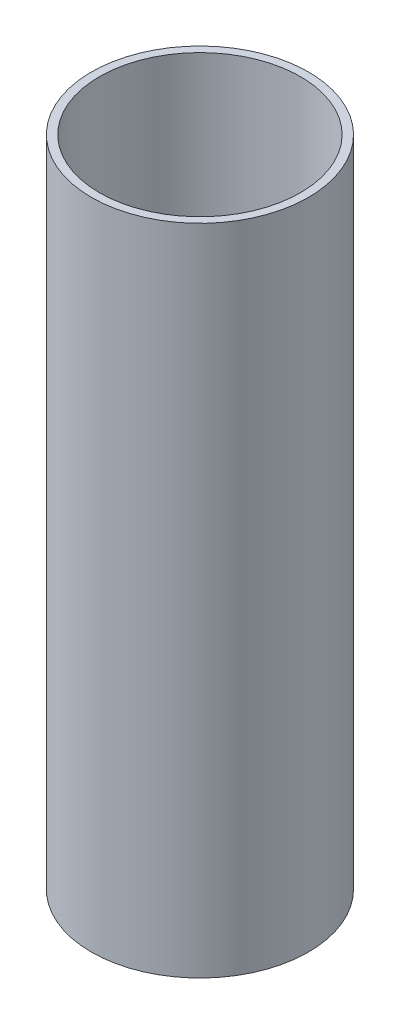
ISO-10303-21;
HEADER;
FILE_DESCRIPTION(('STEP AP214'),'2;1');
FILE_NAME('part.step','',(''),(''),'','','');
FILE_SCHEMA(('AUTOMOTIVE_DESIGN { 1 0 10303 214 1 1 1 1 }'));
ENDSEC;
DATA;
#1=APPLICATION_CONTEXT('core data for automotive mechanical design processes');
#2=APPLICATION_PROTOCOL_DEFINITION('international standard','automotive_design',2000,#1);
#3=PRODUCT_CONTEXT('',#1,'mechanical');
#4=PRODUCT('Part','Part','',(#3));
#5=PRODUCT_RELATED_PRODUCT_CATEGORY('part','',(#4));
#6=PRODUCT_DEFINITION_FORMATION('','',#4);
#7=PRODUCT_DEFINITION_CONTEXT('part definition',#1,'design');
#8=PRODUCT_DEFINITION('design','',#6,#7);
#9=PRODUCT_DEFINITION_SHAPE('','',#8);
#10=(LENGTH_UNIT() NAMED_UNIT(*) SI_UNIT(.MILLI.,.METRE.));
#11=(NAMED_UNIT(*) PLANE_ANGLE_UNIT() SI_UNIT($,.RADIAN.));
#12=(NAMED_UNIT(*) SI_UNIT($,.STERADIAN.) SOLID_ANGLE_UNIT());
#13=UNCERTAINTY_MEASURE_WITH_UNIT(LENGTH_MEASURE(1.E-05),#10,'distance_accuracy_value','');
#14=(GEOMETRIC_REPRESENTATION_CONTEXT(3) GLOBAL_UNCERTAINTY_ASSIGNED_CONTEXT((#13)) GLOBAL_UNIT_ASSIGNED_CONTEXT((#10,
#11,#12)) REPRESENTATION_CONTEXT('',''));
#15=CARTESIAN_POINT('',(0.,0.,0.));
#16=DIRECTION('',(0.,0.,1.));
#17=DIRECTION('',(1.,0.,0.));
#18=AXIS2_PLACEMENT_3D('',#15,#16,#17);
#19=CARTESIAN_POINT('',(0.,82.55,0.));
#20=DIRECTION('',(0.,1.,0.));
#21=DIRECTION('',(0.,0.,1.));
#22=AXIS2_PLACEMENT_3D('',#19,#20,#21);
#23=PLANE('',#22);
#24=CARTESIAN_POINT('',(0.,82.55,0.));
#25=DIRECTION('',(0.,1.,0.));
#26=DIRECTION('',(0.,0.,1.));
#27=AXIS2_PLACEMENT_3D('',#24,#25,#26);
#28=CIRCLE('',#27,13.716);
#29=CARTESIAN_POINT('',(0.,82.55,13.716));
#30=VERTEX_POINT('',#29);
#31=EDGE_CURVE('E10',#30,#30,#28,.T.);
#32=ORIENTED_EDGE('',*,*,#31,.T.);
#33=EDGE_LOOP('',(#32));
#34=FACE_BOUND('',#33,.T.);
#35=CARTESIAN_POINT('',(0.,82.55,0.));
#36=DIRECTION('',(0.,1.,0.));
#37=DIRECTION('',(0.,0.,1.));
#38=AXIS2_PLACEMENT_3D('',#35,#36,#37);
#39=CIRCLE('',#38,12.7);
#40=CARTESIAN_POINT('',(0.,82.55,12.7));
#41=VERTEX_POINT('',#40);
#42=EDGE_CURVE('E41',#41,#41,#39,.T.);
#43=ORIENTED_EDGE('',*,*,#42,.F.);
#44=EDGE_LOOP('',(#43));
#45=FACE_BOUND('',#44,.T.);
#46=ADVANCED_FACE('F30',(#34,#45),#23,.T.);
#47=CARTESIAN_POINT('',(0.,0.,0.));
#48=DIRECTION('',(0.,1.,0.));
#49=DIRECTION('',(0.,0.,1.));
#50=AXIS2_PLACEMENT_3D('',#47,#48,#49);
#51=PLANE('',#50);
#52=CARTESIAN_POINT('',(0.,0.,0.));
#53=DIRECTION('',(0.,1.,0.));
#54=DIRECTION('',(0.,0.,1.));
#55=AXIS2_PLACEMENT_3D('',#52,#53,#54);
#56=CIRCLE('',#55,13.716);
#57=CARTESIAN_POINT('',(0.,0.,13.716));
#58=VERTEX_POINT('',#57);
#59=EDGE_CURVE('E34',#58,#58,#56,.T.);
#60=ORIENTED_EDGE('',*,*,#59,.F.);
#61=EDGE_LOOP('',(#60));
#62=FACE_BOUND('',#61,.T.);
#63=CARTESIAN_POINT('',(0.,0.,0.));
#64=DIRECTION('',(0.,1.,0.));
#65=DIRECTION('',(0.,0.,1.));
#66=AXIS2_PLACEMENT_3D('',#63,#64,#65);
#67=CIRCLE('',#66,12.7);
#68=CARTESIAN_POINT('',(0.,0.,12.7));
#69=VERTEX_POINT('',#68);
#70=EDGE_CURVE('E43',#69,#69,#67,.T.);
#71=ORIENTED_EDGE('',*,*,#70,.T.);
#72=EDGE_LOOP('',(#71));
#73=FACE_BOUND('',#72,.T.);
#74=ADVANCED_FACE('F53',(#62,#73),#51,.F.);
#75=CARTESIAN_POINT('',(0.,82.55,0.));
#76=DIRECTION('',(0.,-1.,0.));
#77=DIRECTION('',(0.,0.,-1.));
#78=AXIS2_PLACEMENT_3D('',#75,#76,#77);
#79=CYLINDRICAL_SURFACE('',#78,13.716);
#80=ORIENTED_EDGE('',*,*,#31,.F.);
#81=EDGE_LOOP('',(#80));
#82=FACE_BOUND('',#81,.T.);
#83=ORIENTED_EDGE('',*,*,#59,.T.);
#84=EDGE_LOOP('',(#83));
#85=FACE_BOUND('',#84,.T.);
#86=ADVANCED_FACE('F32',(#82,#85),#79,.T.);
#87=CARTESIAN_POINT('',(0.,82.55,0.));
#88=DIRECTION('',(0.,-1.,0.));
#89=DIRECTION('',(0.,0.,-1.));
#90=AXIS2_PLACEMENT_3D('',#87,#88,#89);
#91=CYLINDRICAL_SURFACE('',#90,12.7);
#92=ORIENTED_EDGE('',*,*,#42,.T.);
#93=EDGE_LOOP('',(#92));
#94=FACE_BOUND('',#93,.T.);
#95=ORIENTED_EDGE('',*,*,#70,.F.);
#96=EDGE_LOOP('',(#95));
#97=FACE_BOUND('',#96,.T.);
#98=ADVANCED_FACE('F49',(#94,#97),#91,.F.);
#99=CLOSED_SHELL('',(#46,#74,#86,#98));
#100=MANIFOLD_SOLID_BREP('B2',#99);
#101=ADVANCED_BREP_SHAPE_REPRESENTATION('',(#18,#100),#14);
#102=SHAPE_DEFINITION_REPRESENTATION(#9,#101);
ENDSEC;
END-ISO-10303-21;
